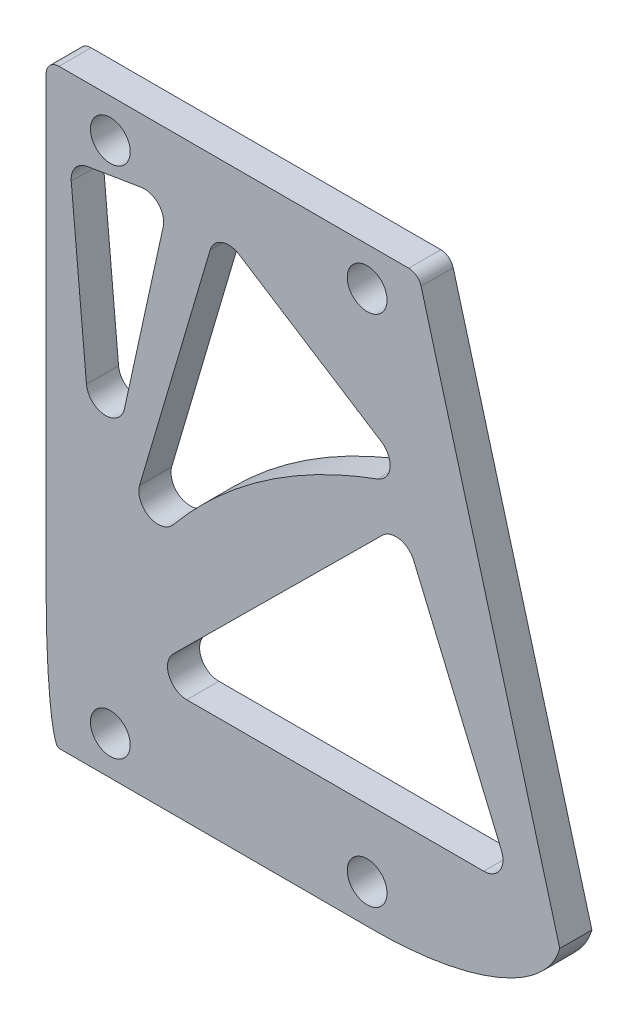
ISO-10303-21;
HEADER;
FILE_DESCRIPTION(('STEP AP214'),'2;1');
FILE_NAME('part.step','',(''),(''),'','','');
FILE_SCHEMA(('AUTOMOTIVE_DESIGN { 1 0 10303 214 1 1 1 1 }'));
ENDSEC;
DATA;
#1=APPLICATION_CONTEXT('core data for automotive mechanical design processes');
#2=APPLICATION_PROTOCOL_DEFINITION('international standard','automotive_design',2000,#1);
#3=PRODUCT_CONTEXT('',#1,'mechanical');
#4=PRODUCT('Part','Part','',(#3));
#5=PRODUCT_RELATED_PRODUCT_CATEGORY('part','',(#4));
#6=PRODUCT_DEFINITION_FORMATION('','',#4);
#7=PRODUCT_DEFINITION_CONTEXT('part definition',#1,'design');
#8=PRODUCT_DEFINITION('design','',#6,#7);
#9=PRODUCT_DEFINITION_SHAPE('','',#8);
#10=(LENGTH_UNIT() NAMED_UNIT(*) SI_UNIT(.MILLI.,.METRE.));
#11=(NAMED_UNIT(*) PLANE_ANGLE_UNIT() SI_UNIT($,.RADIAN.));
#12=(NAMED_UNIT(*) SI_UNIT($,.STERADIAN.) SOLID_ANGLE_UNIT());
#13=UNCERTAINTY_MEASURE_WITH_UNIT(LENGTH_MEASURE(1.E-05),#10,'distance_accuracy_value','');
#14=(GEOMETRIC_REPRESENTATION_CONTEXT(3) GLOBAL_UNCERTAINTY_ASSIGNED_CONTEXT((#13)) GLOBAL_UNIT_ASSIGNED_CONTEXT((#10,
#11,#12)) REPRESENTATION_CONTEXT('',''));
#15=CARTESIAN_POINT('',(0.,0.,0.));
#16=DIRECTION('',(0.,0.,1.));
#17=DIRECTION('',(1.,0.,0.));
#18=AXIS2_PLACEMENT_3D('',#15,#16,#17);
#19=CARTESIAN_POINT('',(0.,0.,2.5));
#20=DIRECTION('',(0.,0.,1.));
#21=DIRECTION('',(1.,0.,0.));
#22=AXIS2_PLACEMENT_3D('',#19,#20,#21);
#23=PLANE('',#22);
#24=DIRECTION('',(0.0900629302357367,-0.995936076561821,0.));
#25=VECTOR('',#24,1.);
#26=CARTESIAN_POINT('',(-10.9826557323448,12.9234198869859,2.5));
#27=LINE('',#26,#25);
#28=CARTESIAN_POINT('',(-13.0452627508542,35.7321907778085,2.5));
#29=VERTEX_POINT('',#28);
#30=CARTESIAN_POINT('',(-11.8600097883053,22.6253977591447,2.5));
#31=VERTEX_POINT('',#30);
#32=EDGE_CURVE('E976',#29,#31,#27,.T.);
#33=ORIENTED_EDGE('',*,*,#32,.F.);
#34=CARTESIAN_POINT('',(-11.5513586360114,35.8672851731621,2.5));
#35=DIRECTION('',(0.,0.,1.));
#36=DIRECTION('',(1.,0.,0.));
#37=AXIS2_PLACEMENT_3D('',#34,#35,#36);
#38=CIRCLE('',#37,1.5);
#39=CARTESIAN_POINT('',(-11.7951330263308,37.3473439715294,2.5));
#40=VERTEX_POINT('',#39);
#41=EDGE_CURVE('E543',#29,#40,#38,.F.);
#42=ORIENTED_EDGE('',*,*,#41,.T.);
#43=DIRECTION('',(-0.986705865578197,-0.16251626021288,0.));
#44=VECTOR('',#43,1.);
#45=CARTESIAN_POINT('',(-13.1708315159974,37.1207583379372,2.5));
#46=LINE('',#45,#44);
#47=CARTESIAN_POINT('',(-7.59106734109896,38.0397783196852,2.5));
#48=VERTEX_POINT('',#47);
#49=EDGE_CURVE('E982',#48,#40,#46,.T.);
#50=ORIENTED_EDGE('',*,*,#49,.F.);
#51=CARTESIAN_POINT('',(-7.34729295077964,36.5597195213179,2.5));
#52=DIRECTION('',(0.,0.,1.));
#53=DIRECTION('',(1.,0.,0.));
#54=AXIS2_PLACEMENT_3D('',#51,#52,#53);
#55=CIRCLE('',#54,1.5);
#56=CARTESIAN_POINT('',(-5.88194806208255,36.2391507187664,2.5));
#57=VERTEX_POINT('',#56);
#58=EDGE_CURVE('E535',#48,#57,#55,.F.);
#59=ORIENTED_EDGE('',*,*,#58,.T.);
#60=DIRECTION('',(0.213712535034332,0.976896592464729,0.));
#61=VECTOR('',#60,1.);
#62=CARTESIAN_POINT('',(-5.40942106946586,38.3991082938366,2.5));
#63=LINE('',#62,#61);
#64=CARTESIAN_POINT('',(-8.90076078476551,22.4399233519468,2.5));
#65=VERTEX_POINT('',#64);
#66=EDGE_CURVE('E979',#65,#57,#63,.T.);
#67=ORIENTED_EDGE('',*,*,#66,.F.);
#68=CARTESIAN_POINT('',(-10.3661056734626,22.7604921544983,2.5));
#69=DIRECTION('',(0.,0.,1.));
#70=DIRECTION('',(1.,0.,0.));
#71=AXIS2_PLACEMENT_3D('',#68,#69,#70);
#72=CIRCLE('',#71,1.5);
#73=EDGE_CURVE('E539',#65,#31,#72,.F.);
#74=ORIENTED_EDGE('',*,*,#73,.T.);
#75=EDGE_LOOP('',(#33,#42,#50,#59,#67,#74));
#76=FACE_BOUND('',#75,.T.);
#77=DIRECTION('',(-0.710270522237621,-0.703928821146213,0.));
#78=VECTOR('',#77,1.);
#79=CARTESIAN_POINT('',(12.7614104465315,25.5242980237078,2.5));
#80=LINE('',#79,#78);
#81=CARTESIAN_POINT('',(11.1879862211887,23.9649222289484,2.5));
#82=VERTEX_POINT('',#81);
#83=CARTESIAN_POINT('',(-5.10367130068704,7.81872593494649,2.5));
#84=VERTEX_POINT('',#83);
#85=EDGE_CURVE('E997',#82,#84,#80,.T.);
#86=ORIENTED_EDGE('',*,*,#85,.F.);
#87=CARTESIAN_POINT('',(12.2438794529081,22.8995164455919,2.5));
#88=DIRECTION('',(0.,0.,1.));
#89=DIRECTION('',(1.,0.,0.));
#90=AXIS2_PLACEMENT_3D('',#87,#88,#89);
#91=CIRCLE('',#90,1.5);
#92=CARTESIAN_POINT('',(13.6251585214191,23.484382357484,2.5));
#93=VERTEX_POINT('',#92);
#94=EDGE_CURVE('E551',#82,#93,#91,.F.);
#95=ORIENTED_EDGE('',*,*,#94,.T.);
#96=DIRECTION('',(-0.389910607928036,0.920852712340681,0.));
#97=VECTOR('',#96,1.);
#98=CARTESIAN_POINT('',(21.3446172932841,5.25332015159005,2.5));
#99=LINE('',#98,#97);
#100=CARTESIAN_POINT('',(20.4618362314919,7.33818606348211,2.5));
#101=VERTEX_POINT('',#100);
#102=EDGE_CURVE('E990',#101,#93,#99,.T.);
#103=ORIENTED_EDGE('',*,*,#102,.F.);
#104=CARTESIAN_POINT('',(19.0805571629809,6.75332015159005,2.5));
#105=DIRECTION('',(0.,0.,1.));
#106=DIRECTION('',(1.,0.,0.));
#107=AXIS2_PLACEMENT_3D('',#104,#105,#106);
#108=CIRCLE('',#107,1.5);
#109=CARTESIAN_POINT('',(19.0805571629809,5.25332015159005,2.5));
#110=VERTEX_POINT('',#109);
#111=EDGE_CURVE('E531',#101,#110,#108,.F.);
#112=ORIENTED_EDGE('',*,*,#111,.T.);
#113=DIRECTION('',(1.,0.,0.));
#114=VECTOR('',#113,1.);
#115=CARTESIAN_POINT('',(-7.6921888478575,5.25332015159005,2.5));
#116=LINE('',#115,#114);
#117=CARTESIAN_POINT('',(-4.04777806896772,5.25332015159005,2.5));
#118=VERTEX_POINT('',#117);
#119=EDGE_CURVE('E994',#118,#110,#116,.T.);
#120=ORIENTED_EDGE('',*,*,#119,.F.);
#121=CARTESIAN_POINT('',(-4.04777806896772,6.75332015159005,2.5));
#122=DIRECTION('',(0.,0.,1.));
#123=DIRECTION('',(1.,0.,0.));
#124=AXIS2_PLACEMENT_3D('',#121,#122,#123);
#125=CIRCLE('',#124,1.5);
#126=EDGE_CURVE('E547',#118,#84,#125,.F.);
#127=ORIENTED_EDGE('',*,*,#126,.T.);
#128=EDGE_LOOP('',(#86,#95,#103,#112,#120,#127));
#129=FACE_BOUND('',#128,.T.);
#130=DIRECTION('',(-0.282937871459199,-0.959138238677897,0.));
#131=VECTOR('',#130,1.);
#132=CARTESIAN_POINT('',(-1.66568191290359,38.3991082938366,2.5));
#133=LINE('',#132,#131);
#134=CARTESIAN_POINT('',(-2.23037525463893,36.4848400681237,2.5));
#135=VERTEX_POINT('',#134);
#136=CARTESIAN_POINT('',(-7.71613684377938,17.8885182633427,2.5));
#137=VERTEX_POINT('',#136);
#138=EDGE_CURVE('E932',#135,#137,#133,.T.);
#139=ORIENTED_EDGE('',*,*,#138,.F.);
#140=CARTESIAN_POINT('',(-0.791667896622081,36.0604332609349,2.5));
#141=DIRECTION('',(0.,0.,1.));
#142=DIRECTION('',(1.,0.,0.));
#143=AXIS2_PLACEMENT_3D('',#140,#141,#142);
#144=CIRCLE('',#143,1.5);
#145=CARTESIAN_POINT('',(0.016063544387566,37.3243833862185,2.5));
#146=VERTEX_POINT('',#145);
#147=EDGE_CURVE('E527',#135,#146,#144,.F.);
#148=ORIENTED_EDGE('',*,*,#147,.T.);
#149=DIRECTION('',(-0.842633416855746,0.538487627339766,0.));
#150=VECTOR('',#149,1.);
#151=CARTESIAN_POINT('',(-1.66568191290359,38.3991082938366,2.5));
#152=LINE('',#151,#150);
#153=CARTESIAN_POINT('',(11.0982243403269,30.2422924633697,2.5));
#154=VERTEX_POINT('',#153);
#155=EDGE_CURVE('E940',#154,#146,#152,.T.);
#156=ORIENTED_EDGE('',*,*,#155,.F.);
#157=CARTESIAN_POINT('',(10.2904928993173,28.9783423380861,2.5));
#158=DIRECTION('',(0.,0.,1.));
#159=DIRECTION('',(1.,0.,0.));
#160=AXIS2_PLACEMENT_3D('',#157,#158,#159);
#161=CIRCLE('',#160,1.5);
#162=CARTESIAN_POINT('',(10.8058290826331,27.5696448481453,2.5));
#163=VERTEX_POINT('',#162);
#164=EDGE_CURVE('E519',#154,#163,#161,.F.);
#165=ORIENTED_EDGE('',*,*,#164,.T.);
#166=CARTESIAN_POINT('',(-10.9826557323448,6.81526335678432,2.5));
#167=CARTESIAN_POINT('',(-3.76980581329199,23.4496538241166,2.5));
#168=CARTESIAN_POINT('',(13.7658282690239,28.5375514911847,2.5));
#169=B_SPLINE_CURVE_WITH_KNOTS('',2,(#166,#167,#168),.UNSPECIFIED.,.F.,.F.,(3,3),(0.,1.),.UNSPECIFIED.);
#170=CARTESIAN_POINT('',(-5.12116120993314,16.5085782676614,2.5));
#171=VERTEX_POINT('',#170);
#172=EDGE_CURVE('E935',#171,#163,#169,.T.);
#173=ORIENTED_EDGE('',*,*,#172,.F.);
#174=CARTESIAN_POINT('',(-6.27742948576251,17.4641114561539,2.5));
#175=DIRECTION('',(0.,0.,1.));
#176=DIRECTION('',(1.,0.,0.));
#177=AXIS2_PLACEMENT_3D('',#174,#175,#176);
#178=CIRCLE('',#177,1.5);
#179=EDGE_CURVE('E523',#171,#137,#178,.F.);
#180=ORIENTED_EDGE('',*,*,#179,.T.);
#181=EDGE_LOOP('',(#139,#148,#156,#165,#173,#180));
#182=FACE_BOUND('',#181,.T.);
#183=CARTESIAN_POINT('',(10.,40.,2.5));
#184=DIRECTION('',(0.,0.,1.));
#185=DIRECTION('',(-1.,0.,0.));
#186=AXIS2_PLACEMENT_3D('',#183,#184,#185);
#187=CIRCLE('',#186,1.54999999999999);
#188=CARTESIAN_POINT('',(8.45000000000001,40.,2.5));
#189=VERTEX_POINT('',#188);
#190=EDGE_CURVE('E644',#189,#189,#187,.T.);
#191=ORIENTED_EDGE('',*,*,#190,.F.);
#192=EDGE_LOOP('',(#191));
#193=FACE_BOUND('',#192,.T.);
#194=CARTESIAN_POINT('',(-10.,0.,2.5));
#195=DIRECTION('',(0.,0.,1.));
#196=DIRECTION('',(1.,0.,0.));
#197=AXIS2_PLACEMENT_3D('',#194,#195,#196);
#198=CIRCLE('',#197,1.54999999999999);
#199=CARTESIAN_POINT('',(-8.45000000000001,0.,2.5));
#200=VERTEX_POINT('',#199);
#201=EDGE_CURVE('E568',#200,#200,#198,.T.);
#202=ORIENTED_EDGE('',*,*,#201,.F.);
#203=EDGE_LOOP('',(#202));
#204=FACE_BOUND('',#203,.T.);
#205=DIRECTION('',(-0.265156483021042,0.96420539280379,0.));
#206=VECTOR('',#205,1.);
#207=CARTESIAN_POINT('',(14.,43.,2.5));
#208=LINE('',#207,#206);
#209=CARTESIAN_POINT('',(25.,3.,2.5));
#210=VERTEX_POINT('',#209);
#211=CARTESIAN_POINT('',(14.2020819671692,42.265156483021,2.5));
#212=VERTEX_POINT('',#211);
#213=EDGE_CURVE('E217',#210,#212,#208,.T.);
#214=ORIENTED_EDGE('',*,*,#213,.T.);
#215=CARTESIAN_POINT('',(13.2378765743654,42.,2.5));
#216=DIRECTION('',(0.,0.,1.));
#217=DIRECTION('',(1.,0.,0.));
#218=AXIS2_PLACEMENT_3D('',#215,#216,#217);
#219=CIRCLE('',#218,1.);
#220=CARTESIAN_POINT('',(13.2378765743654,43.,2.5));
#221=VERTEX_POINT('',#220);
#222=EDGE_CURVE('E48',#212,#221,#219,.T.);
#223=ORIENTED_EDGE('',*,*,#222,.T.);
#224=DIRECTION('',(-1.,0.,0.));
#225=VECTOR('',#224,1.);
#226=CARTESIAN_POINT('',(-15.,43.,2.5));
#227=LINE('',#226,#225);
#228=CARTESIAN_POINT('',(-14.,43.,2.5));
#229=VERTEX_POINT('',#228);
#230=EDGE_CURVE('E234',#221,#229,#227,.T.);
#231=ORIENTED_EDGE('',*,*,#230,.T.);
#232=CARTESIAN_POINT('',(-14.,42.,2.5));
#233=DIRECTION('',(0.,0.,1.));
#234=DIRECTION('',(1.,0.,0.));
#235=AXIS2_PLACEMENT_3D('',#232,#233,#234);
#236=CIRCLE('',#235,1.);
#237=CARTESIAN_POINT('',(-15.,42.,2.5));
#238=VERTEX_POINT('',#237);
#239=EDGE_CURVE('E55',#229,#238,#236,.T.);
#240=ORIENTED_EDGE('',*,*,#239,.T.);
#241=DIRECTION('',(0.,-1.,0.));
#242=VECTOR('',#241,1.);
#243=CARTESIAN_POINT('',(-15.,37.,2.5));
#244=LINE('',#243,#242);
#245=CARTESIAN_POINT('',(-15.,7.,2.5));
#246=VERTEX_POINT('',#245);
#247=EDGE_CURVE('E613',#238,#246,#244,.T.);
#248=ORIENTED_EDGE('',*,*,#247,.T.);
#249=CARTESIAN_POINT('',(-14.,-3.,2.5));
#250=CARTESIAN_POINT('',(-15.,-3.,2.5));
#251=CARTESIAN_POINT('',(-15.,7.,2.5));
#252=(BOUNDED_CURVE() B_SPLINE_CURVE(2,(#249,#250,#251),.UNSPECIFIED.,.F.,
.F.) B_SPLINE_CURVE_WITH_KNOTS((3,3),(0.,1.),
.UNSPECIFIED.) CURVE() GEOMETRIC_REPRESENTATION_ITEM() RATIONAL_B_SPLINE_CURVE((1.,
0.707106781186548,1.)) REPRESENTATION_ITEM(''));
#253=CARTESIAN_POINT('',(-14.,-3.,2.5));
#254=VERTEX_POINT('',#253);
#255=EDGE_CURVE('E439',#246,#254,#252,.F.);
#256=ORIENTED_EDGE('',*,*,#255,.T.);
#257=DIRECTION('',(1.,0.,0.));
#258=VECTOR('',#257,1.);
#259=CARTESIAN_POINT('',(-15.,-3.,2.5));
#260=LINE('',#259,#258);
#261=CARTESIAN_POINT('',(10.543167705199,-3.,2.5));
#262=VERTEX_POINT('',#261);
#263=EDGE_CURVE('E220',#254,#262,#260,.T.);
#264=ORIENTED_EDGE('',*,*,#263,.T.);
#265=CARTESIAN_POINT('',(25.,3.,2.5));
#266=CARTESIAN_POINT('',(23.3398852867214,-3.,2.5));
#267=CARTESIAN_POINT('',(10.543167705199,-3.,2.5));
#268=(BOUNDED_CURVE() B_SPLINE_CURVE(2,(#265,#266,#267),.UNSPECIFIED.,.F.,
.F.) B_SPLINE_CURVE_WITH_KNOTS((3,3),(0.,1.),
.UNSPECIFIED.) CURVE() GEOMETRIC_REPRESENTATION_ITEM() RATIONAL_B_SPLINE_CURVE((1.,
0.795822425754221,1.)) REPRESENTATION_ITEM(''));
#269=EDGE_CURVE('E214',#262,#210,#268,.F.);
#270=ORIENTED_EDGE('',*,*,#269,.T.);
#271=EDGE_LOOP('',(#214,#223,#231,#240,#248,#256,#264,#270));
#272=FACE_BOUND('',#271,.T.);
#273=CARTESIAN_POINT('',(10.,0.,2.5));
#274=DIRECTION('',(0.,0.,1.));
#275=DIRECTION('',(1.,0.,0.));
#276=AXIS2_PLACEMENT_3D('',#273,#274,#275);
#277=CIRCLE('',#276,1.55);
#278=CARTESIAN_POINT('',(11.55,0.,2.5));
#279=VERTEX_POINT('',#278);
#280=EDGE_CURVE('E648',#279,#279,#277,.T.);
#281=ORIENTED_EDGE('',*,*,#280,.F.);
#282=EDGE_LOOP('',(#281));
#283=FACE_BOUND('',#282,.T.);
#284=CARTESIAN_POINT('',(-10.,40.,2.5));
#285=DIRECTION('',(0.,0.,1.));
#286=DIRECTION('',(-1.,0.,0.));
#287=AXIS2_PLACEMENT_3D('',#284,#285,#286);
#288=CIRCLE('',#287,1.54999999999999);
#289=CARTESIAN_POINT('',(-11.55,40.,2.5));
#290=VERTEX_POINT('',#289);
#291=EDGE_CURVE('E634',#290,#290,#288,.T.);
#292=ORIENTED_EDGE('',*,*,#291,.F.);
#293=EDGE_LOOP('',(#292));
#294=FACE_BOUND('',#293,.T.);
#295=ADVANCED_FACE('F40',(#76,#129,#182,#193,#204,#272,#283,#294),#23,.T.);
#296=CARTESIAN_POINT('',(0.,0.,0.));
#297=DIRECTION('',(0.,0.,1.));
#298=DIRECTION('',(1.,0.,0.));
#299=AXIS2_PLACEMENT_3D('',#296,#297,#298);
#300=PLANE('',#299);
#301=DIRECTION('',(0.213712535034332,0.976896592464729,0.));
#302=VECTOR('',#301,1.);
#303=CARTESIAN_POINT('',(-5.40942106946586,38.3991082938366,0.));
#304=LINE('',#303,#302);
#305=CARTESIAN_POINT('',(-8.90076078476551,22.4399233519468,0.));
#306=VERTEX_POINT('',#305);
#307=CARTESIAN_POINT('',(-5.88194806208255,36.2391507187664,0.));
#308=VERTEX_POINT('',#307);
#309=EDGE_CURVE('E967',#306,#308,#304,.T.);
#310=ORIENTED_EDGE('',*,*,#309,.T.);
#311=CARTESIAN_POINT('',(-7.34729295077964,36.5597195213179,0.));
#312=DIRECTION('',(0.,0.,1.));
#313=DIRECTION('',(1.,0.,0.));
#314=AXIS2_PLACEMENT_3D('',#311,#312,#313);
#315=CIRCLE('',#314,1.5);
#316=CARTESIAN_POINT('',(-7.59106734109896,38.0397783196852,0.));
#317=VERTEX_POINT('',#316);
#318=EDGE_CURVE('E537',#308,#317,#315,.T.);
#319=ORIENTED_EDGE('',*,*,#318,.T.);
#320=DIRECTION('',(-0.986705865578197,-0.16251626021288,0.));
#321=VECTOR('',#320,1.);
#322=CARTESIAN_POINT('',(-13.1708315159974,37.1207583379372,0.));
#323=LINE('',#322,#321);
#324=CARTESIAN_POINT('',(-11.7951330263308,37.3473439715294,0.));
#325=VERTEX_POINT('',#324);
#326=EDGE_CURVE('E936',#317,#325,#323,.T.);
#327=ORIENTED_EDGE('',*,*,#326,.T.);
#328=CARTESIAN_POINT('',(-11.5513586360114,35.8672851731621,0.));
#329=DIRECTION('',(0.,0.,1.));
#330=DIRECTION('',(1.,0.,0.));
#331=AXIS2_PLACEMENT_3D('',#328,#329,#330);
#332=CIRCLE('',#331,1.5);
#333=CARTESIAN_POINT('',(-13.0452627508542,35.7321907778085,0.));
#334=VERTEX_POINT('',#333);
#335=EDGE_CURVE('E545',#325,#334,#332,.T.);
#336=ORIENTED_EDGE('',*,*,#335,.T.);
#337=DIRECTION('',(0.0900629302357367,-0.995936076561821,0.));
#338=VECTOR('',#337,1.);
#339=CARTESIAN_POINT('',(-10.9826557323448,12.9234198869859,0.));
#340=LINE('',#339,#338);
#341=CARTESIAN_POINT('',(-11.8600097883053,22.6253977591447,0.));
#342=VERTEX_POINT('',#341);
#343=EDGE_CURVE('E972',#334,#342,#340,.T.);
#344=ORIENTED_EDGE('',*,*,#343,.T.);
#345=CARTESIAN_POINT('',(-10.3661056734626,22.7604921544983,0.));
#346=DIRECTION('',(0.,0.,1.));
#347=DIRECTION('',(1.,0.,0.));
#348=AXIS2_PLACEMENT_3D('',#345,#346,#347);
#349=CIRCLE('',#348,1.5);
#350=EDGE_CURVE('E541',#342,#306,#349,.T.);
#351=ORIENTED_EDGE('',*,*,#350,.T.);
#352=EDGE_LOOP('',(#310,#319,#327,#336,#344,#351));
#353=FACE_BOUND('',#352,.T.);
#354=DIRECTION('',(1.,0.,0.));
#355=VECTOR('',#354,1.);
#356=CARTESIAN_POINT('',(-7.6921888478575,5.25332015159005,0.));
#357=LINE('',#356,#355);
#358=CARTESIAN_POINT('',(-4.04777806896772,5.25332015159005,0.));
#359=VERTEX_POINT('',#358);
#360=CARTESIAN_POINT('',(19.0805571629809,5.25332015159005,0.));
#361=VERTEX_POINT('',#360);
#362=EDGE_CURVE('E1002',#359,#361,#357,.T.);
#363=ORIENTED_EDGE('',*,*,#362,.T.);
#364=CARTESIAN_POINT('',(19.0805571629809,6.75332015159005,0.));
#365=DIRECTION('',(0.,0.,1.));
#366=DIRECTION('',(1.,0.,0.));
#367=AXIS2_PLACEMENT_3D('',#364,#365,#366);
#368=CIRCLE('',#367,1.5);
#369=CARTESIAN_POINT('',(20.4618362314919,7.33818606348211,0.));
#370=VERTEX_POINT('',#369);
#371=EDGE_CURVE('E533',#361,#370,#368,.T.);
#372=ORIENTED_EDGE('',*,*,#371,.T.);
#373=DIRECTION('',(-0.389910607928036,0.920852712340681,0.));
#374=VECTOR('',#373,1.);
#375=CARTESIAN_POINT('',(21.3446172932841,5.25332015159005,0.));
#376=LINE('',#375,#374);
#377=CARTESIAN_POINT('',(13.6251585214191,23.484382357484,0.));
#378=VERTEX_POINT('',#377);
#379=EDGE_CURVE('E980',#370,#378,#376,.T.);
#380=ORIENTED_EDGE('',*,*,#379,.T.);
#381=CARTESIAN_POINT('',(12.2438794529081,22.8995164455919,0.));
#382=DIRECTION('',(0.,0.,1.));
#383=DIRECTION('',(1.,0.,0.));
#384=AXIS2_PLACEMENT_3D('',#381,#382,#383);
#385=CIRCLE('',#384,1.5);
#386=CARTESIAN_POINT('',(11.1879862211887,23.9649222289484,0.));
#387=VERTEX_POINT('',#386);
#388=EDGE_CURVE('E553',#378,#387,#385,.T.);
#389=ORIENTED_EDGE('',*,*,#388,.T.);
#390=DIRECTION('',(-0.710270522237621,-0.703928821146213,0.));
#391=VECTOR('',#390,1.);
#392=CARTESIAN_POINT('',(12.7614104465315,25.5242980237078,0.));
#393=LINE('',#392,#391);
#394=CARTESIAN_POINT('',(-5.10367130068704,7.81872593494649,0.));
#395=VERTEX_POINT('',#394);
#396=EDGE_CURVE('E993',#387,#395,#393,.T.);
#397=ORIENTED_EDGE('',*,*,#396,.T.);
#398=CARTESIAN_POINT('',(-4.04777806896772,6.75332015159005,0.));
#399=DIRECTION('',(0.,0.,1.));
#400=DIRECTION('',(1.,0.,0.));
#401=AXIS2_PLACEMENT_3D('',#398,#399,#400);
#402=CIRCLE('',#401,1.5);
#403=EDGE_CURVE('E549',#395,#359,#402,.T.);
#404=ORIENTED_EDGE('',*,*,#403,.T.);
#405=EDGE_LOOP('',(#363,#372,#380,#389,#397,#404));
#406=FACE_BOUND('',#405,.T.);
#407=CARTESIAN_POINT('',(-10.9826557323448,6.81526335678432,0.));
#408=CARTESIAN_POINT('',(-3.76980581329199,23.4496538241166,0.));
#409=CARTESIAN_POINT('',(13.7658282690239,28.5375514911847,0.));
#410=B_SPLINE_CURVE_WITH_KNOTS('',2,(#407,#408,#409),.UNSPECIFIED.,.F.,.F.,(3,3),(0.,1.),.UNSPECIFIED.);
#411=CARTESIAN_POINT('',(-5.12116120993314,16.5085782676614,0.));
#412=VERTEX_POINT('',#411);
#413=CARTESIAN_POINT('',(10.8058290826331,27.5696448481453,0.));
#414=VERTEX_POINT('',#413);
#415=EDGE_CURVE('E640',#412,#414,#410,.T.);
#416=ORIENTED_EDGE('',*,*,#415,.T.);
#417=CARTESIAN_POINT('',(10.2904928993173,28.9783423380861,0.));
#418=DIRECTION('',(0.,0.,1.));
#419=DIRECTION('',(1.,0.,0.));
#420=AXIS2_PLACEMENT_3D('',#417,#418,#419);
#421=CIRCLE('',#420,1.5);
#422=CARTESIAN_POINT('',(11.0982243403269,30.2422924633697,0.));
#423=VERTEX_POINT('',#422);
#424=EDGE_CURVE('E521',#414,#423,#421,.T.);
#425=ORIENTED_EDGE('',*,*,#424,.T.);
#426=DIRECTION('',(-0.842633416855746,0.538487627339766,0.));
#427=VECTOR('',#426,1.);
#428=CARTESIAN_POINT('',(-1.66568191290359,38.3991082938366,0.));
#429=LINE('',#428,#427);
#430=CARTESIAN_POINT('',(0.016063544387566,37.3243833862185,0.));
#431=VERTEX_POINT('',#430);
#432=EDGE_CURVE('E635',#423,#431,#429,.T.);
#433=ORIENTED_EDGE('',*,*,#432,.T.);
#434=CARTESIAN_POINT('',(-0.791667896622081,36.0604332609349,0.));
#435=DIRECTION('',(0.,0.,1.));
#436=DIRECTION('',(1.,0.,0.));
#437=AXIS2_PLACEMENT_3D('',#434,#435,#436);
#438=CIRCLE('',#437,1.5);
#439=CARTESIAN_POINT('',(-2.23037525463893,36.4848400681237,0.));
#440=VERTEX_POINT('',#439);
#441=EDGE_CURVE('E529',#431,#440,#438,.T.);
#442=ORIENTED_EDGE('',*,*,#441,.T.);
#443=DIRECTION('',(-0.282937871459199,-0.959138238677897,0.));
#444=VECTOR('',#443,1.);
#445=CARTESIAN_POINT('',(-1.66568191290359,38.3991082938366,0.));
#446=LINE('',#445,#444);
#447=CARTESIAN_POINT('',(-7.71613684377938,17.8885182633427,0.));
#448=VERTEX_POINT('',#447);
#449=EDGE_CURVE('E926',#440,#448,#446,.T.);
#450=ORIENTED_EDGE('',*,*,#449,.T.);
#451=CARTESIAN_POINT('',(-6.27742948576251,17.4641114561539,0.));
#452=DIRECTION('',(0.,0.,1.));
#453=DIRECTION('',(1.,0.,0.));
#454=AXIS2_PLACEMENT_3D('',#451,#452,#453);
#455=CIRCLE('',#454,1.5);
#456=EDGE_CURVE('E525',#448,#412,#455,.T.);
#457=ORIENTED_EDGE('',*,*,#456,.T.);
#458=EDGE_LOOP('',(#416,#425,#433,#442,#450,#457));
#459=FACE_BOUND('',#458,.T.);
#460=DIRECTION('',(-1.,0.,0.));
#461=VECTOR('',#460,1.);
#462=CARTESIAN_POINT('',(-15.,43.,0.));
#463=LINE('',#462,#461);
#464=CARTESIAN_POINT('',(13.2378765743654,43.,0.));
#465=VERTEX_POINT('',#464);
#466=CARTESIAN_POINT('',(-14.,43.,0.));
#467=VERTEX_POINT('',#466);
#468=EDGE_CURVE('E468',#465,#467,#463,.T.);
#469=ORIENTED_EDGE('',*,*,#468,.F.);
#470=CARTESIAN_POINT('',(13.2378765743654,42.,0.));
#471=DIRECTION('',(0.,0.,1.));
#472=DIRECTION('',(1.,0.,0.));
#473=AXIS2_PLACEMENT_3D('',#470,#471,#472);
#474=CIRCLE('',#473,1.);
#475=CARTESIAN_POINT('',(14.2020819671692,42.265156483021,0.));
#476=VERTEX_POINT('',#475);
#477=EDGE_CURVE('E667',#465,#476,#474,.F.);
#478=ORIENTED_EDGE('',*,*,#477,.T.);
#479=DIRECTION('',(-0.265156483021042,0.96420539280379,0.));
#480=VECTOR('',#479,1.);
#481=CARTESIAN_POINT('',(14.,43.,0.));
#482=LINE('',#481,#480);
#483=CARTESIAN_POINT('',(25.,3.,0.));
#484=VERTEX_POINT('',#483);
#485=EDGE_CURVE('E561',#484,#476,#482,.T.);
#486=ORIENTED_EDGE('',*,*,#485,.F.);
#487=CARTESIAN_POINT('',(10.543167705199,-3.,0.));
#488=CARTESIAN_POINT('',(23.3398852867214,-3.,0.));
#489=CARTESIAN_POINT('',(25.,3.,0.));
#490=(BOUNDED_CURVE() B_SPLINE_CURVE(2,(#487,#488,#489),.UNSPECIFIED.,.F.,
.F.) B_SPLINE_CURVE_WITH_KNOTS((3,3),(0.,1.),
.UNSPECIFIED.) CURVE() GEOMETRIC_REPRESENTATION_ITEM() RATIONAL_B_SPLINE_CURVE((1.,
0.795822425754221,1.)) REPRESENTATION_ITEM(''));
#491=CARTESIAN_POINT('',(10.543167705199,-3.,0.));
#492=VERTEX_POINT('',#491);
#493=EDGE_CURVE('E240',#484,#492,#490,.F.);
#494=ORIENTED_EDGE('',*,*,#493,.T.);
#495=DIRECTION('',(1.,0.,0.));
#496=VECTOR('',#495,1.);
#497=CARTESIAN_POINT('',(-15.,-3.,0.));
#498=LINE('',#497,#496);
#499=CARTESIAN_POINT('',(-14.,-3.,0.));
#500=VERTEX_POINT('',#499);
#501=EDGE_CURVE('E235',#500,#492,#498,.T.);
#502=ORIENTED_EDGE('',*,*,#501,.F.);
#503=CARTESIAN_POINT('',(-15.,7.,0.));
#504=CARTESIAN_POINT('',(-15.,-3.,0.));
#505=CARTESIAN_POINT('',(-14.,-3.,0.));
#506=(BOUNDED_CURVE() B_SPLINE_CURVE(2,(#503,#504,#505),.UNSPECIFIED.,.F.,
.F.) B_SPLINE_CURVE_WITH_KNOTS((3,3),(0.,1.),
.UNSPECIFIED.) CURVE() GEOMETRIC_REPRESENTATION_ITEM() RATIONAL_B_SPLINE_CURVE((1.,
0.707106781186548,1.)) REPRESENTATION_ITEM(''));
#507=CARTESIAN_POINT('',(-15.,7.,0.));
#508=VERTEX_POINT('',#507);
#509=EDGE_CURVE('E418',#500,#508,#506,.F.);
#510=ORIENTED_EDGE('',*,*,#509,.T.);
#511=DIRECTION('',(0.,-1.,0.));
#512=VECTOR('',#511,1.);
#513=CARTESIAN_POINT('',(-15.,3.,0.));
#514=LINE('',#513,#512);
#515=CARTESIAN_POINT('',(-15.,42.,0.));
#516=VERTEX_POINT('',#515);
#517=EDGE_CURVE('E465',#516,#508,#514,.T.);
#518=ORIENTED_EDGE('',*,*,#517,.F.);
#519=CARTESIAN_POINT('',(-14.,42.,0.));
#520=DIRECTION('',(0.,0.,1.));
#521=DIRECTION('',(1.,0.,0.));
#522=AXIS2_PLACEMENT_3D('',#519,#520,#521);
#523=CIRCLE('',#522,1.);
#524=EDGE_CURVE('E464',#516,#467,#523,.F.);
#525=ORIENTED_EDGE('',*,*,#524,.T.);
#526=EDGE_LOOP('',(#469,#478,#486,#494,#502,#510,#518,#525));
#527=FACE_BOUND('',#526,.T.);
#528=CARTESIAN_POINT('',(-10.,0.,0.));
#529=DIRECTION('',(0.,0.,1.));
#530=DIRECTION('',(1.,0.,0.));
#531=AXIS2_PLACEMENT_3D('',#528,#529,#530);
#532=CIRCLE('',#531,1.54999999999999);
#533=CARTESIAN_POINT('',(-8.45000000000001,0.,0.));
#534=VERTEX_POINT('',#533);
#535=EDGE_CURVE('E621',#534,#534,#532,.T.);
#536=ORIENTED_EDGE('',*,*,#535,.T.);
#537=EDGE_LOOP('',(#536));
#538=FACE_BOUND('',#537,.T.);
#539=CARTESIAN_POINT('',(10.,0.,0.));
#540=DIRECTION('',(0.,0.,1.));
#541=DIRECTION('',(1.,0.,0.));
#542=AXIS2_PLACEMENT_3D('',#539,#540,#541);
#543=CIRCLE('',#542,1.55);
#544=CARTESIAN_POINT('',(11.55,0.,0.));
#545=VERTEX_POINT('',#544);
#546=EDGE_CURVE('E625',#545,#545,#543,.T.);
#547=ORIENTED_EDGE('',*,*,#546,.T.);
#548=EDGE_LOOP('',(#547));
#549=FACE_BOUND('',#548,.T.);
#550=CARTESIAN_POINT('',(10.,40.,0.));
#551=DIRECTION('',(0.,0.,1.));
#552=DIRECTION('',(-1.,0.,0.));
#553=AXIS2_PLACEMENT_3D('',#550,#551,#552);
#554=CIRCLE('',#553,1.54999999999999);
#555=CARTESIAN_POINT('',(8.45000000000001,40.,0.));
#556=VERTEX_POINT('',#555);
#557=EDGE_CURVE('E629',#556,#556,#554,.T.);
#558=ORIENTED_EDGE('',*,*,#557,.T.);
#559=EDGE_LOOP('',(#558));
#560=FACE_BOUND('',#559,.T.);
#561=CARTESIAN_POINT('',(-10.,40.,0.));
#562=DIRECTION('',(0.,0.,1.));
#563=DIRECTION('',(-1.,0.,0.));
#564=AXIS2_PLACEMENT_3D('',#561,#562,#563);
#565=CIRCLE('',#564,1.54999999999999);
#566=CARTESIAN_POINT('',(-11.55,40.,0.));
#567=VERTEX_POINT('',#566);
#568=EDGE_CURVE('E632',#567,#567,#565,.T.);
#569=ORIENTED_EDGE('',*,*,#568,.T.);
#570=EDGE_LOOP('',(#569));
#571=FACE_BOUND('',#570,.T.);
#572=ADVANCED_FACE('F345',(#353,#406,#459,#527,#538,#549,#560,#571),#300,.F.);
#573=CARTESIAN_POINT('',(14.,43.,2.5));
#574=DIRECTION('',(-0.96420539280379,-0.265156483021042,0.));
#575=DIRECTION('',(0.265156483021042,-0.96420539280379,0.));
#576=AXIS2_PLACEMENT_3D('',#573,#574,#575);
#577=PLANE('',#576);
#578=ORIENTED_EDGE('',*,*,#485,.T.);
#579=DIRECTION('',(0.,0.,-1.));
#580=VECTOR('',#579,1.);
#581=CARTESIAN_POINT('',(14.2020819671692,42.265156483021,2.5));
#582=LINE('',#581,#580);
#583=EDGE_CURVE('E63',#476,#212,#582,.F.);
#584=ORIENTED_EDGE('',*,*,#583,.T.);
#585=ORIENTED_EDGE('',*,*,#213,.F.);
#586=CARTESIAN_POINT('',(25.,3.,-0.125));
#587=CARTESIAN_POINT('',(25.,3.,0.791666666666668));
#588=CARTESIAN_POINT('',(25.,3.,1.70833333333333));
#589=CARTESIAN_POINT('',(25.,3.,2.625));
#590=(BOUNDED_CURVE() B_SPLINE_CURVE(3,(#586,#587,#588,#589),.UNSPECIFIED.,.F.,
.F.) B_SPLINE_CURVE_WITH_KNOTS((4,4),(-0.000125,0.002625),
.UNSPECIFIED.) CURVE() GEOMETRIC_REPRESENTATION_ITEM() RATIONAL_B_SPLINE_CURVE((1.,1.,1.,1.)) REPRESENTATION_ITEM(''));
#591=EDGE_CURVE('E232',#210,#484,#590,.F.);
#592=ORIENTED_EDGE('',*,*,#591,.T.);
#593=EDGE_LOOP('',(#578,#584,#585,#592));
#594=FACE_BOUND('',#593,.T.);
#595=ADVANCED_FACE('F231',(#594),#577,.F.);
#596=CARTESIAN_POINT('',(-15.,43.,2.5));
#597=DIRECTION('',(0.,-1.,0.));
#598=DIRECTION('',(0.,0.,-1.));
#599=AXIS2_PLACEMENT_3D('',#596,#597,#598);
#600=PLANE('',#599);
#601=ORIENTED_EDGE('',*,*,#230,.F.);
#602=DIRECTION('',(0.,0.,-1.));
#603=VECTOR('',#602,1.);
#604=CARTESIAN_POINT('',(13.2378765743654,43.,2.5));
#605=LINE('',#604,#603);
#606=EDGE_CURVE('E461',#221,#465,#605,.T.);
#607=ORIENTED_EDGE('',*,*,#606,.T.);
#608=ORIENTED_EDGE('',*,*,#468,.T.);
#609=DIRECTION('',(0.,0.,-1.));
#610=VECTOR('',#609,1.);
#611=CARTESIAN_POINT('',(-14.,43.,2.5));
#612=LINE('',#611,#610);
#613=EDGE_CURVE('E454',#467,#229,#612,.F.);
#614=ORIENTED_EDGE('',*,*,#613,.T.);
#615=EDGE_LOOP('',(#601,#607,#608,#614));
#616=FACE_BOUND('',#615,.T.);
#617=ADVANCED_FACE('F344',(#616),#600,.F.);
#618=CARTESIAN_POINT('',(-15.,3.,2.5));
#619=DIRECTION('',(1.,0.,0.));
#620=DIRECTION('',(0.,1.,0.));
#621=AXIS2_PLACEMENT_3D('',#618,#619,#620);
#622=PLANE('',#621);
#623=ORIENTED_EDGE('',*,*,#247,.F.);
#624=DIRECTION('',(0.,0.,-1.));
#625=VECTOR('',#624,1.);
#626=CARTESIAN_POINT('',(-15.,42.,2.5));
#627=LINE('',#626,#625);
#628=EDGE_CURVE('E12',#238,#516,#627,.T.);
#629=ORIENTED_EDGE('',*,*,#628,.T.);
#630=ORIENTED_EDGE('',*,*,#517,.T.);
#631=CARTESIAN_POINT('',(-15.,7.,2.625));
#632=CARTESIAN_POINT('',(-15.,7.,1.70833333333333));
#633=CARTESIAN_POINT('',(-15.,7.,0.791666666666668));
#634=CARTESIAN_POINT('',(-15.,7.,-0.125));
#635=(BOUNDED_CURVE() B_SPLINE_CURVE(3,(#631,#632,#633,#634),.UNSPECIFIED.,.F.,
.F.) B_SPLINE_CURVE_WITH_KNOTS((4,4),(-0.000125,0.002625),
.UNSPECIFIED.) CURVE() GEOMETRIC_REPRESENTATION_ITEM() RATIONAL_B_SPLINE_CURVE((1.,1.,1.,1.)) REPRESENTATION_ITEM(''));
#636=EDGE_CURVE('E450',#508,#246,#635,.F.);
#637=ORIENTED_EDGE('',*,*,#636,.T.);
#638=EDGE_LOOP('',(#623,#629,#630,#637));
#639=FACE_BOUND('',#638,.T.);
#640=ADVANCED_FACE('F582',(#639),#622,.F.);
#641=CARTESIAN_POINT('',(-15.,-3.,2.5));
#642=DIRECTION('',(0.,1.,0.));
#643=DIRECTION('',(0.,0.,1.));
#644=AXIS2_PLACEMENT_3D('',#641,#642,#643);
#645=PLANE('',#644);
#646=ORIENTED_EDGE('',*,*,#263,.F.);
#647=CARTESIAN_POINT('',(-14.,-3.,-0.125));
#648=CARTESIAN_POINT('',(-14.,-3.,0.791666666666668));
#649=CARTESIAN_POINT('',(-14.,-3.,1.70833333333333));
#650=CARTESIAN_POINT('',(-14.,-3.,2.625));
#651=(BOUNDED_CURVE() B_SPLINE_CURVE(3,(#647,#648,#649,#650),.UNSPECIFIED.,.F.,
.F.) B_SPLINE_CURVE_WITH_KNOTS((4,4),(-0.000125,0.002625),
.UNSPECIFIED.) CURVE() GEOMETRIC_REPRESENTATION_ITEM() RATIONAL_B_SPLINE_CURVE((1.,1.,1.,1.)) REPRESENTATION_ITEM(''));
#652=EDGE_CURVE('E226',#254,#500,#651,.F.);
#653=ORIENTED_EDGE('',*,*,#652,.T.);
#654=ORIENTED_EDGE('',*,*,#501,.T.);
#655=CARTESIAN_POINT('',(10.543167705199,-3.,2.625));
#656=CARTESIAN_POINT('',(10.543167705199,-3.,1.70833333333333));
#657=CARTESIAN_POINT('',(10.543167705199,-3.,0.791666666666668));
#658=CARTESIAN_POINT('',(10.543167705199,-3.,-0.125));
#659=(BOUNDED_CURVE() B_SPLINE_CURVE(3,(#655,#656,#657,#658),.UNSPECIFIED.,.F.,
.F.) B_SPLINE_CURVE_WITH_KNOTS((4,4),(-0.000125,0.002625),
.UNSPECIFIED.) CURVE() GEOMETRIC_REPRESENTATION_ITEM() RATIONAL_B_SPLINE_CURVE((1.,1.,1.,1.)) REPRESENTATION_ITEM(''));
#660=EDGE_CURVE('E227',#492,#262,#659,.F.);
#661=ORIENTED_EDGE('',*,*,#660,.T.);
#662=EDGE_LOOP('',(#646,#653,#654,#661));
#663=FACE_BOUND('',#662,.T.);
#664=ADVANCED_FACE('F574',(#663),#645,.F.);
#665=CARTESIAN_POINT('',(-10.,0.,2.5));
#666=DIRECTION('',(0.,0.,-1.));
#667=DIRECTION('',(-1.,0.,0.));
#668=AXIS2_PLACEMENT_3D('',#665,#666,#667);
#669=CYLINDRICAL_SURFACE('',#668,1.54999999999999);
#670=ORIENTED_EDGE('',*,*,#201,.T.);
#671=EDGE_LOOP('',(#670));
#672=FACE_BOUND('',#671,.T.);
#673=ORIENTED_EDGE('',*,*,#535,.F.);
#674=EDGE_LOOP('',(#673));
#675=FACE_BOUND('',#674,.T.);
#676=ADVANCED_FACE('F395',(#672,#675),#669,.F.);
#677=CARTESIAN_POINT('',(10.,0.,2.5));
#678=DIRECTION('',(0.,0.,-1.));
#679=DIRECTION('',(-1.,0.,0.));
#680=AXIS2_PLACEMENT_3D('',#677,#678,#679);
#681=CYLINDRICAL_SURFACE('',#680,1.55);
#682=ORIENTED_EDGE('',*,*,#280,.T.);
#683=EDGE_LOOP('',(#682));
#684=FACE_BOUND('',#683,.T.);
#685=ORIENTED_EDGE('',*,*,#546,.F.);
#686=EDGE_LOOP('',(#685));
#687=FACE_BOUND('',#686,.T.);
#688=ADVANCED_FACE('F842',(#684,#687),#681,.F.);
#689=CARTESIAN_POINT('',(10.,40.,2.5));
#690=DIRECTION('',(0.,0.,-1.));
#691=DIRECTION('',(-1.,0.,0.));
#692=AXIS2_PLACEMENT_3D('',#689,#690,#691);
#693=CYLINDRICAL_SURFACE('',#692,1.54999999999999);
#694=ORIENTED_EDGE('',*,*,#190,.T.);
#695=EDGE_LOOP('',(#694));
#696=FACE_BOUND('',#695,.T.);
#697=ORIENTED_EDGE('',*,*,#557,.F.);
#698=EDGE_LOOP('',(#697));
#699=FACE_BOUND('',#698,.T.);
#700=ADVANCED_FACE('F832',(#696,#699),#693,.F.);
#701=CARTESIAN_POINT('',(-10.,40.,2.5));
#702=DIRECTION('',(0.,0.,-1.));
#703=DIRECTION('',(-1.,0.,0.));
#704=AXIS2_PLACEMENT_3D('',#701,#702,#703);
#705=CYLINDRICAL_SURFACE('',#704,1.54999999999999);
#706=ORIENTED_EDGE('',*,*,#291,.T.);
#707=EDGE_LOOP('',(#706));
#708=FACE_BOUND('',#707,.T.);
#709=ORIENTED_EDGE('',*,*,#568,.F.);
#710=EDGE_LOOP('',(#709));
#711=FACE_BOUND('',#710,.T.);
#712=ADVANCED_FACE('F822',(#708,#711),#705,.F.);
#713=CARTESIAN_POINT('',(-1.66568191290359,38.3991082938366,0.));
#714=DIRECTION('',(-0.959138238677897,0.282937871459199,0.));
#715=DIRECTION('',(-0.282937871459199,-0.959138238677897,0.));
#716=AXIS2_PLACEMENT_3D('',#713,#714,#715);
#717=PLANE('',#716);
#718=ORIENTED_EDGE('',*,*,#138,.T.);
#719=DIRECTION('',(0.,0.,-1.));
#720=VECTOR('',#719,1.);
#721=CARTESIAN_POINT('',(-7.71613684377938,17.8885182633427,0.));
#722=LINE('',#721,#720);
#723=EDGE_CURVE('E487',#137,#448,#722,.T.);
#724=ORIENTED_EDGE('',*,*,#723,.T.);
#725=ORIENTED_EDGE('',*,*,#449,.F.);
#726=DIRECTION('',(0.,0.,1.));
#727=VECTOR('',#726,1.);
#728=CARTESIAN_POINT('',(-2.23037525463893,36.4848400681237,2.5));
#729=LINE('',#728,#727);
#730=EDGE_CURVE('E484',#440,#135,#729,.T.);
#731=ORIENTED_EDGE('',*,*,#730,.T.);
#732=EDGE_LOOP('',(#718,#724,#725,#731));
#733=FACE_BOUND('',#732,.T.);
#734=ADVANCED_FACE('F812',(#733),#717,.F.);
#735=CARTESIAN_POINT('',(-1.66568191290359,38.3991082938366,0.));
#736=DIRECTION('',(0.538487627339766,0.842633416855746,0.));
#737=DIRECTION('',(-0.842633416855746,0.538487627339766,0.));
#738=AXIS2_PLACEMENT_3D('',#735,#736,#737);
#739=PLANE('',#738);
#740=ORIENTED_EDGE('',*,*,#432,.F.);
#741=DIRECTION('',(0.,0.,-1.));
#742=VECTOR('',#741,1.);
#743=CARTESIAN_POINT('',(11.0982243403269,30.2422924633697,2.5));
#744=LINE('',#743,#742);
#745=EDGE_CURVE('E476',#423,#154,#744,.F.);
#746=ORIENTED_EDGE('',*,*,#745,.T.);
#747=ORIENTED_EDGE('',*,*,#155,.T.);
#748=DIRECTION('',(0.,0.,1.));
#749=VECTOR('',#748,1.);
#750=CARTESIAN_POINT('',(0.0160635443875668,37.3243833862185,0.));
#751=LINE('',#750,#749);
#752=EDGE_CURVE('E243',#146,#431,#751,.F.);
#753=ORIENTED_EDGE('',*,*,#752,.T.);
#754=EDGE_LOOP('',(#740,#746,#747,#753));
#755=FACE_BOUND('',#754,.T.);
#756=ADVANCED_FACE('F802',(#755),#739,.F.);
#757=DIRECTION('',(0.,0.,1.));
#758=VECTOR('',#757,1.);
#759=SURFACE_OF_LINEAR_EXTRUSION('',#410,#758);
#760=ORIENTED_EDGE('',*,*,#172,.T.);
#761=DIRECTION('',(0.,0.,1.));
#762=VECTOR('',#761,1.);
#763=CARTESIAN_POINT('',(10.8058290826331,27.5696448481453,2.5));
#764=LINE('',#763,#762);
#765=EDGE_CURVE('E482',#163,#414,#764,.F.);
#766=ORIENTED_EDGE('',*,*,#765,.T.);
#767=ORIENTED_EDGE('',*,*,#415,.F.);
#768=DIRECTION('',(0.,0.,1.));
#769=VECTOR('',#768,1.);
#770=CARTESIAN_POINT('',(-5.12116120993078,16.5085782676643,0.));
#771=LINE('',#770,#769);
#772=EDGE_CURVE('E479',#412,#171,#771,.T.);
#773=ORIENTED_EDGE('',*,*,#772,.T.);
#774=EDGE_LOOP('',(#760,#766,#767,#773));
#775=FACE_BOUND('',#774,.T.);
#776=ADVANCED_FACE('F792',(#775),#759,.F.);
#777=CARTESIAN_POINT('',(12.7614104465315,25.5242980237078,0.));
#778=DIRECTION('',(-0.703928821146213,0.710270522237621,0.));
#779=DIRECTION('',(-0.710270522237621,-0.703928821146213,0.));
#780=AXIS2_PLACEMENT_3D('',#777,#778,#779);
#781=PLANE('',#780);
#782=ORIENTED_EDGE('',*,*,#85,.T.);
#783=DIRECTION('',(0.,0.,1.));
#784=VECTOR('',#783,1.);
#785=CARTESIAN_POINT('',(-5.10367130068704,7.81872593494648,0.));
#786=LINE('',#785,#784);
#787=EDGE_CURVE('E517',#84,#395,#786,.F.);
#788=ORIENTED_EDGE('',*,*,#787,.T.);
#789=ORIENTED_EDGE('',*,*,#396,.F.);
#790=DIRECTION('',(0.,0.,1.));
#791=VECTOR('',#790,1.);
#792=CARTESIAN_POINT('',(11.1879862211887,23.9649222289484,2.5));
#793=LINE('',#792,#791);
#794=EDGE_CURVE('E514',#387,#82,#793,.T.);
#795=ORIENTED_EDGE('',*,*,#794,.T.);
#796=EDGE_LOOP('',(#782,#788,#789,#795));
#797=FACE_BOUND('',#796,.T.);
#798=ADVANCED_FACE('F782',(#797),#781,.F.);
#799=CARTESIAN_POINT('',(21.3446172932841,5.25332015159005,0.));
#800=DIRECTION('',(0.920852712340681,0.389910607928036,0.));
#801=DIRECTION('',(-0.389910607928036,0.920852712340681,0.));
#802=AXIS2_PLACEMENT_3D('',#799,#800,#801);
#803=PLANE('',#802);
#804=ORIENTED_EDGE('',*,*,#379,.F.);
#805=DIRECTION('',(0.,0.,1.));
#806=VECTOR('',#805,1.);
#807=CARTESIAN_POINT('',(20.4618362314919,7.33818606348211,2.5));
#808=LINE('',#807,#806);
#809=EDGE_CURVE('E491',#370,#101,#808,.T.);
#810=ORIENTED_EDGE('',*,*,#809,.T.);
#811=ORIENTED_EDGE('',*,*,#102,.T.);
#812=DIRECTION('',(0.,0.,1.));
#813=VECTOR('',#812,1.);
#814=CARTESIAN_POINT('',(13.6251585214191,23.484382357484,0.));
#815=LINE('',#814,#813);
#816=EDGE_CURVE('E489',#93,#378,#815,.F.);
#817=ORIENTED_EDGE('',*,*,#816,.T.);
#818=EDGE_LOOP('',(#804,#810,#811,#817));
#819=FACE_BOUND('',#818,.T.);
#820=ADVANCED_FACE('F772',(#819),#803,.F.);
#821=CARTESIAN_POINT('',(-7.6921888478575,5.25332015159005,0.));
#822=DIRECTION('',(0.,-1.,0.));
#823=DIRECTION('',(0.,0.,-1.));
#824=AXIS2_PLACEMENT_3D('',#821,#822,#823);
#825=PLANE('',#824);
#826=ORIENTED_EDGE('',*,*,#119,.T.);
#827=DIRECTION('',(0.,0.,1.));
#828=VECTOR('',#827,1.);
#829=CARTESIAN_POINT('',(19.0805571629809,5.25332015159005,0.));
#830=LINE('',#829,#828);
#831=EDGE_CURVE('E497',#110,#361,#830,.F.);
#832=ORIENTED_EDGE('',*,*,#831,.T.);
#833=ORIENTED_EDGE('',*,*,#362,.F.);
#834=DIRECTION('',(0.,0.,1.));
#835=VECTOR('',#834,1.);
#836=CARTESIAN_POINT('',(-4.04777806896772,5.25332015159005,2.5));
#837=LINE('',#836,#835);
#838=EDGE_CURVE('E494',#359,#118,#837,.T.);
#839=ORIENTED_EDGE('',*,*,#838,.T.);
#840=EDGE_LOOP('',(#826,#832,#833,#839));
#841=FACE_BOUND('',#840,.T.);
#842=ADVANCED_FACE('F762',(#841),#825,.F.);
#843=CARTESIAN_POINT('',(-10.9826557323448,12.9234198869859,0.));
#844=DIRECTION('',(-0.995936076561821,-0.0900629302357367,0.));
#845=DIRECTION('',(0.0900629302357367,-0.995936076561821,0.));
#846=AXIS2_PLACEMENT_3D('',#843,#844,#845);
#847=PLANE('',#846);
#848=ORIENTED_EDGE('',*,*,#32,.T.);
#849=DIRECTION('',(0.,0.,1.));
#850=VECTOR('',#849,1.);
#851=CARTESIAN_POINT('',(-11.8600097883053,22.6253977591447,0.));
#852=LINE('',#851,#850);
#853=EDGE_CURVE('E512',#31,#342,#852,.F.);
#854=ORIENTED_EDGE('',*,*,#853,.T.);
#855=ORIENTED_EDGE('',*,*,#343,.F.);
#856=DIRECTION('',(0.,0.,1.));
#857=VECTOR('',#856,1.);
#858=CARTESIAN_POINT('',(-13.0452627508542,35.7321907778085,2.5));
#859=LINE('',#858,#857);
#860=EDGE_CURVE('E509',#334,#29,#859,.T.);
#861=ORIENTED_EDGE('',*,*,#860,.T.);
#862=EDGE_LOOP('',(#848,#854,#855,#861));
#863=FACE_BOUND('',#862,.T.);
#864=ADVANCED_FACE('F752',(#863),#847,.F.);
#865=CARTESIAN_POINT('',(-13.1708315159974,37.1207583379372,0.));
#866=DIRECTION('',(-0.16251626021288,0.986705865578197,0.));
#867=DIRECTION('',(-0.986705865578197,-0.16251626021288,0.));
#868=AXIS2_PLACEMENT_3D('',#865,#866,#867);
#869=PLANE('',#868);
#870=ORIENTED_EDGE('',*,*,#326,.F.);
#871=DIRECTION('',(0.,0.,1.));
#872=VECTOR('',#871,1.);
#873=CARTESIAN_POINT('',(-7.59106734109896,38.0397783196852,2.5));
#874=LINE('',#873,#872);
#875=EDGE_CURVE('E501',#317,#48,#874,.T.);
#876=ORIENTED_EDGE('',*,*,#875,.T.);
#877=ORIENTED_EDGE('',*,*,#49,.T.);
#878=DIRECTION('',(0.,0.,1.));
#879=VECTOR('',#878,1.);
#880=CARTESIAN_POINT('',(-11.7951330263308,37.3473439715294,0.));
#881=LINE('',#880,#879);
#882=EDGE_CURVE('E499',#40,#325,#881,.F.);
#883=ORIENTED_EDGE('',*,*,#882,.T.);
#884=EDGE_LOOP('',(#870,#876,#877,#883));
#885=FACE_BOUND('',#884,.T.);
#886=ADVANCED_FACE('F742',(#885),#869,.F.);
#887=CARTESIAN_POINT('',(-5.40942106946586,38.3991082938366,0.));
#888=DIRECTION('',(0.976896592464729,-0.213712535034332,0.));
#889=DIRECTION('',(0.213712535034332,0.976896592464729,0.));
#890=AXIS2_PLACEMENT_3D('',#887,#888,#889);
#891=PLANE('',#890);
#892=ORIENTED_EDGE('',*,*,#66,.T.);
#893=DIRECTION('',(0.,0.,1.));
#894=VECTOR('',#893,1.);
#895=CARTESIAN_POINT('',(-5.88194806208255,36.2391507187664,0.));
#896=LINE('',#895,#894);
#897=EDGE_CURVE('E507',#57,#308,#896,.F.);
#898=ORIENTED_EDGE('',*,*,#897,.T.);
#899=ORIENTED_EDGE('',*,*,#309,.F.);
#900=DIRECTION('',(0.,0.,1.));
#901=VECTOR('',#900,1.);
#902=CARTESIAN_POINT('',(-8.90076078476551,22.4399233519468,2.5));
#903=LINE('',#902,#901);
#904=EDGE_CURVE('E504',#306,#65,#903,.T.);
#905=ORIENTED_EDGE('',*,*,#904,.T.);
#906=EDGE_LOOP('',(#892,#898,#899,#905));
#907=FACE_BOUND('',#906,.T.);
#908=ADVANCED_FACE('F351',(#907),#891,.F.);
#909=CARTESIAN_POINT('',(10.2904928993173,28.9783423380861,1.25));
#910=DIRECTION('',(0.,0.,1.));
#911=DIRECTION('',(1.,0.,0.));
#912=AXIS2_PLACEMENT_3D('',#909,#910,#911);
#913=CYLINDRICAL_SURFACE('',#912,1.5);
#914=ORIENTED_EDGE('',*,*,#424,.F.);
#915=ORIENTED_EDGE('',*,*,#765,.F.);
#916=ORIENTED_EDGE('',*,*,#164,.F.);
#917=ORIENTED_EDGE('',*,*,#745,.F.);
#918=EDGE_LOOP('',(#914,#915,#916,#917));
#919=FACE_BOUND('',#918,.T.);
#920=ADVANCED_FACE('F347',(#919),#913,.F.);
#921=CARTESIAN_POINT('',(-6.27742948576251,17.4641114561539,1.25));
#922=DIRECTION('',(0.,0.,1.));
#923=DIRECTION('',(1.,0.,0.));
#924=AXIS2_PLACEMENT_3D('',#921,#922,#923);
#925=CYLINDRICAL_SURFACE('',#924,1.5);
#926=ORIENTED_EDGE('',*,*,#456,.F.);
#927=ORIENTED_EDGE('',*,*,#723,.F.);
#928=ORIENTED_EDGE('',*,*,#179,.F.);
#929=ORIENTED_EDGE('',*,*,#772,.F.);
#930=EDGE_LOOP('',(#926,#927,#928,#929));
#931=FACE_BOUND('',#930,.T.);
#932=ADVANCED_FACE('F350',(#931),#925,.F.);
#933=CARTESIAN_POINT('',(-0.791667896622081,36.0604332609349,0.));
#934=DIRECTION('',(0.,0.,-1.));
#935=DIRECTION('',(-1.,0.,0.));
#936=AXIS2_PLACEMENT_3D('',#933,#934,#935);
#937=CYLINDRICAL_SURFACE('',#936,1.5);
#938=ORIENTED_EDGE('',*,*,#441,.F.);
#939=ORIENTED_EDGE('',*,*,#752,.F.);
#940=ORIENTED_EDGE('',*,*,#147,.F.);
#941=ORIENTED_EDGE('',*,*,#730,.F.);
#942=EDGE_LOOP('',(#938,#939,#940,#941));
#943=FACE_BOUND('',#942,.T.);
#944=ADVANCED_FACE('F355',(#943),#937,.F.);
#945=CARTESIAN_POINT('',(19.0805571629809,6.75332015159005,0.));
#946=DIRECTION('',(0.,0.,-1.));
#947=DIRECTION('',(-1.,0.,0.));
#948=AXIS2_PLACEMENT_3D('',#945,#946,#947);
#949=CYLINDRICAL_SURFACE('',#948,1.5);
#950=ORIENTED_EDGE('',*,*,#371,.F.);
#951=ORIENTED_EDGE('',*,*,#831,.F.);
#952=ORIENTED_EDGE('',*,*,#111,.F.);
#953=ORIENTED_EDGE('',*,*,#809,.F.);
#954=EDGE_LOOP('',(#950,#951,#952,#953));
#955=FACE_BOUND('',#954,.T.);
#956=ADVANCED_FACE('F359',(#955),#949,.F.);
#957=CARTESIAN_POINT('',(-7.34729295077964,36.5597195213179,0.));
#958=DIRECTION('',(0.,0.,-1.));
#959=DIRECTION('',(-1.,0.,0.));
#960=AXIS2_PLACEMENT_3D('',#957,#958,#959);
#961=CYLINDRICAL_SURFACE('',#960,1.5);
#962=ORIENTED_EDGE('',*,*,#318,.F.);
#963=ORIENTED_EDGE('',*,*,#897,.F.);
#964=ORIENTED_EDGE('',*,*,#58,.F.);
#965=ORIENTED_EDGE('',*,*,#875,.F.);
#966=EDGE_LOOP('',(#962,#963,#964,#965));
#967=FACE_BOUND('',#966,.T.);
#968=ADVANCED_FACE('F363',(#967),#961,.F.);
#969=CARTESIAN_POINT('',(-10.3661056734626,22.7604921544983,0.));
#970=DIRECTION('',(0.,0.,-1.));
#971=DIRECTION('',(-1.,0.,0.));
#972=AXIS2_PLACEMENT_3D('',#969,#970,#971);
#973=CYLINDRICAL_SURFACE('',#972,1.5);
#974=ORIENTED_EDGE('',*,*,#350,.F.);
#975=ORIENTED_EDGE('',*,*,#853,.F.);
#976=ORIENTED_EDGE('',*,*,#73,.F.);
#977=ORIENTED_EDGE('',*,*,#904,.F.);
#978=EDGE_LOOP('',(#974,#975,#976,#977));
#979=FACE_BOUND('',#978,.T.);
#980=ADVANCED_FACE('F367',(#979),#973,.F.);
#981=CARTESIAN_POINT('',(-11.5513586360114,35.8672851731621,0.));
#982=DIRECTION('',(0.,0.,-1.));
#983=DIRECTION('',(-1.,0.,0.));
#984=AXIS2_PLACEMENT_3D('',#981,#982,#983);
#985=CYLINDRICAL_SURFACE('',#984,1.5);
#986=ORIENTED_EDGE('',*,*,#335,.F.);
#987=ORIENTED_EDGE('',*,*,#882,.F.);
#988=ORIENTED_EDGE('',*,*,#41,.F.);
#989=ORIENTED_EDGE('',*,*,#860,.F.);
#990=EDGE_LOOP('',(#986,#987,#988,#989));
#991=FACE_BOUND('',#990,.T.);
#992=ADVANCED_FACE('F371',(#991),#985,.F.);
#993=CARTESIAN_POINT('',(-4.04777806896772,6.75332015159005,0.));
#994=DIRECTION('',(0.,0.,-1.));
#995=DIRECTION('',(-1.,0.,0.));
#996=AXIS2_PLACEMENT_3D('',#993,#994,#995);
#997=CYLINDRICAL_SURFACE('',#996,1.5);
#998=ORIENTED_EDGE('',*,*,#403,.F.);
#999=ORIENTED_EDGE('',*,*,#787,.F.);
#1000=ORIENTED_EDGE('',*,*,#126,.F.);
#1001=ORIENTED_EDGE('',*,*,#838,.F.);
#1002=EDGE_LOOP('',(#998,#999,#1000,#1001));
#1003=FACE_BOUND('',#1002,.T.);
#1004=ADVANCED_FACE('F374',(#1003),#997,.F.);
#1005=CARTESIAN_POINT('',(12.2438794529081,22.8995164455919,0.));
#1006=DIRECTION('',(0.,0.,-1.));
#1007=DIRECTION('',(-1.,0.,0.));
#1008=AXIS2_PLACEMENT_3D('',#1005,#1006,#1007);
#1009=CYLINDRICAL_SURFACE('',#1008,1.5);
#1010=ORIENTED_EDGE('',*,*,#388,.F.);
#1011=ORIENTED_EDGE('',*,*,#816,.F.);
#1012=ORIENTED_EDGE('',*,*,#94,.F.);
#1013=ORIENTED_EDGE('',*,*,#794,.F.);
#1014=EDGE_LOOP('',(#1010,#1011,#1012,#1013));
#1015=FACE_BOUND('',#1014,.T.);
#1016=ADVANCED_FACE('F267',(#1015),#1009,.F.);
#1017=CARTESIAN_POINT('',(25.,3.,2.625));
#1018=CARTESIAN_POINT('',(25.,3.,1.70833333333333));
#1019=CARTESIAN_POINT('',(25.,3.,0.791666666666668));
#1020=CARTESIAN_POINT('',(25.,3.,-0.125));
#1021=CARTESIAN_POINT('',(23.3398852867214,-3.,2.625));
#1022=CARTESIAN_POINT('',(23.3398852867214,-3.,1.70833333333333));
#1023=CARTESIAN_POINT('',(23.3398852867214,-3.,0.791666666666668));
#1024=CARTESIAN_POINT('',(23.3398852867214,-3.,-0.125));
#1025=CARTESIAN_POINT('',(10.543167705199,-3.,2.625));
#1026=CARTESIAN_POINT('',(10.543167705199,-3.,1.70833333333333));
#1027=CARTESIAN_POINT('',(10.543167705199,-3.,0.791666666666668));
#1028=CARTESIAN_POINT('',(10.543167705199,-3.,-0.125));
#1029=(BOUNDED_SURFACE() B_SPLINE_SURFACE(2,3,((#1017,#1018,#1019,#1020),(#1021,#1022,#1023,
#1024),(#1025,#1026,#1027,#1028)),.UNSPECIFIED.,.F.,.F.,.F.) B_SPLINE_SURFACE_WITH_KNOTS((3,3),
(4,4),(0.,1.),(-0.000125,0.002625),
.UNSPECIFIED.) GEOMETRIC_REPRESENTATION_ITEM() RATIONAL_B_SPLINE_SURFACE(((1.,1.,1.,1.),
(0.795822425754221,0.795822425754221,0.795822425754221,0.795822425754221),(1.,1.,1.,1.))) REPRESENTATION_ITEM('') SURFACE());
#1030=ORIENTED_EDGE('',*,*,#269,.F.);
#1031=ORIENTED_EDGE('',*,*,#660,.F.);
#1032=ORIENTED_EDGE('',*,*,#493,.F.);
#1033=ORIENTED_EDGE('',*,*,#591,.F.);
#1034=EDGE_LOOP('',(#1030,#1031,#1032,#1033));
#1035=FACE_BOUND('',#1034,.T.);
#1036=ADVANCED_FACE('F238',(#1035),#1029,.T.);
#1037=CARTESIAN_POINT('',(-14.,-3.,2.625));
#1038=CARTESIAN_POINT('',(-14.,-3.,1.70833333333333));
#1039=CARTESIAN_POINT('',(-14.,-3.,0.791666666666668));
#1040=CARTESIAN_POINT('',(-14.,-3.,-0.125));
#1041=CARTESIAN_POINT('',(-15.,-3.,2.625));
#1042=CARTESIAN_POINT('',(-15.,-3.,1.70833333333333));
#1043=CARTESIAN_POINT('',(-15.,-3.,0.791666666666668));
#1044=CARTESIAN_POINT('',(-15.,-3.,-0.125));
#1045=CARTESIAN_POINT('',(-15.,7.,2.625));
#1046=CARTESIAN_POINT('',(-15.,7.,1.70833333333333));
#1047=CARTESIAN_POINT('',(-15.,7.,0.791666666666668));
#1048=CARTESIAN_POINT('',(-15.,7.,-0.125));
#1049=(BOUNDED_SURFACE() B_SPLINE_SURFACE(2,3,((#1037,#1038,#1039,#1040),(#1041,#1042,#1043,
#1044),(#1045,#1046,#1047,#1048)),.UNSPECIFIED.,.F.,.F.,.F.) B_SPLINE_SURFACE_WITH_KNOTS((3,3),
(4,4),(0.,1.),(-0.000125,0.002625),
.UNSPECIFIED.) GEOMETRIC_REPRESENTATION_ITEM() RATIONAL_B_SPLINE_SURFACE(((1.,1.,1.,1.),
(0.707106781186548,0.707106781186548,0.707106781186548,0.707106781186548),(1.,1.,1.,1.))) REPRESENTATION_ITEM('') SURFACE());
#1050=ORIENTED_EDGE('',*,*,#255,.F.);
#1051=ORIENTED_EDGE('',*,*,#636,.F.);
#1052=ORIENTED_EDGE('',*,*,#509,.F.);
#1053=ORIENTED_EDGE('',*,*,#652,.F.);
#1054=EDGE_LOOP('',(#1050,#1051,#1052,#1053));
#1055=FACE_BOUND('',#1054,.T.);
#1056=ADVANCED_FACE('F266',(#1055),#1049,.T.);
#1057=CARTESIAN_POINT('',(13.2378765743654,42.,2.5));
#1058=DIRECTION('',(0.,0.,-1.));
#1059=DIRECTION('',(-1.,0.,0.));
#1060=AXIS2_PLACEMENT_3D('',#1057,#1058,#1059);
#1061=CYLINDRICAL_SURFACE('',#1060,1.);
#1062=ORIENTED_EDGE('',*,*,#222,.F.);
#1063=ORIENTED_EDGE('',*,*,#583,.F.);
#1064=ORIENTED_EDGE('',*,*,#477,.F.);
#1065=ORIENTED_EDGE('',*,*,#606,.F.);
#1066=EDGE_LOOP('',(#1062,#1063,#1064,#1065));
#1067=FACE_BOUND('',#1066,.T.);
#1068=ADVANCED_FACE('F666',(#1067),#1061,.T.);
#1069=CARTESIAN_POINT('',(-14.,42.,2.5));
#1070=DIRECTION('',(0.,0.,-1.));
#1071=DIRECTION('',(-1.,0.,0.));
#1072=AXIS2_PLACEMENT_3D('',#1069,#1070,#1071);
#1073=CYLINDRICAL_SURFACE('',#1072,1.);
#1074=ORIENTED_EDGE('',*,*,#239,.F.);
#1075=ORIENTED_EDGE('',*,*,#613,.F.);
#1076=ORIENTED_EDGE('',*,*,#524,.F.);
#1077=ORIENTED_EDGE('',*,*,#628,.F.);
#1078=EDGE_LOOP('',(#1074,#1075,#1076,#1077));
#1079=FACE_BOUND('',#1078,.T.);
#1080=ADVANCED_FACE('F42',(#1079),#1073,.T.);
#1081=CLOSED_SHELL('',(#295,#572,#595,#617,#640,#664,#676,#688,#700,#712,#734,#756,#776,#798,
#820,#842,#864,#886,#908,#920,#932,#944,#956,#968,#980,#992,#1004,#1016,#1036,#1056,#1068,#1080));
#1082=MANIFOLD_SOLID_BREP('B2',#1081);
#1083=ADVANCED_BREP_SHAPE_REPRESENTATION('',(#18,#1082),#14);
#1084=SHAPE_DEFINITION_REPRESENTATION(#9,#1083);
ENDSEC;
END-ISO-10303-21;
